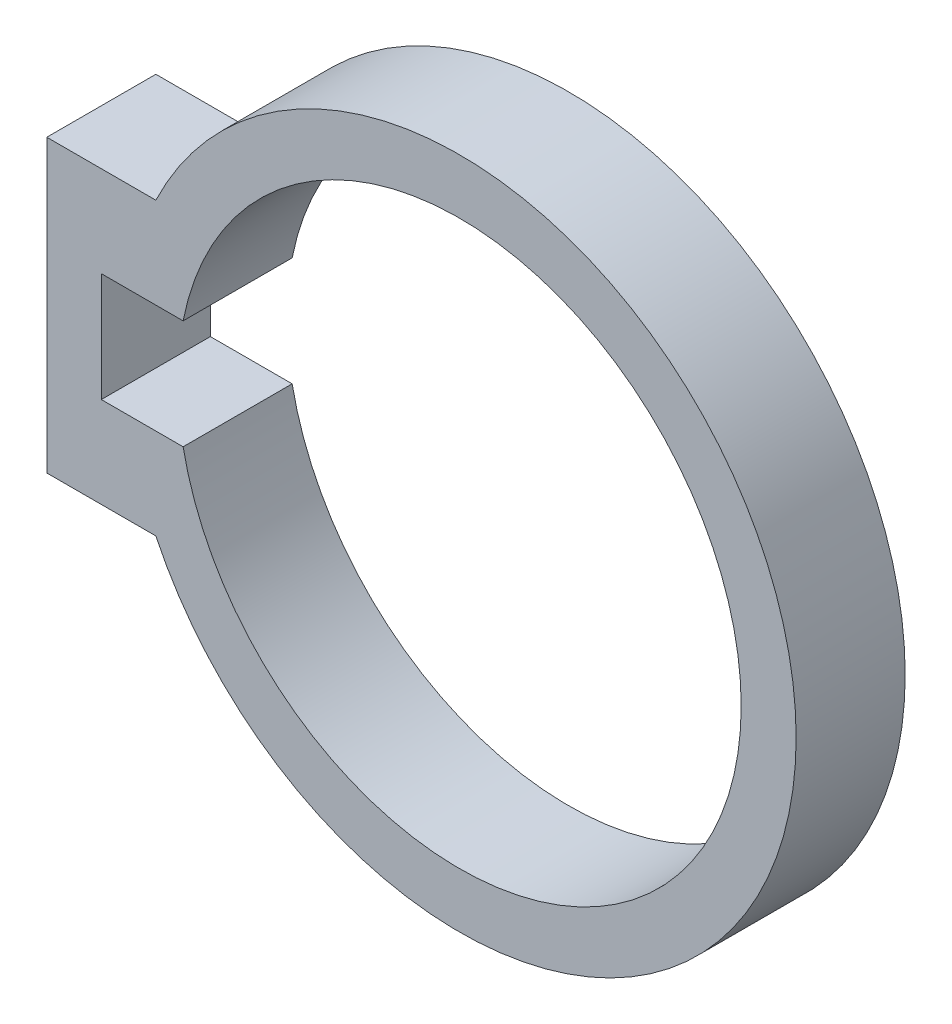
ISO-10303-21;
HEADER;
FILE_DESCRIPTION(('STEP AP214'),'2;1');
FILE_NAME('part.step','',(''),(''),'','','');
FILE_SCHEMA(('AUTOMOTIVE_DESIGN { 1 0 10303 214 1 1 1 1 }'));
ENDSEC;
DATA;
#1=APPLICATION_CONTEXT('core data for automotive mechanical design processes');
#2=APPLICATION_PROTOCOL_DEFINITION('international standard','automotive_design',2000,#1);
#3=PRODUCT_CONTEXT('',#1,'mechanical');
#4=PRODUCT('Part','Part','',(#3));
#5=PRODUCT_RELATED_PRODUCT_CATEGORY('part','',(#4));
#6=PRODUCT_DEFINITION_FORMATION('','',#4);
#7=PRODUCT_DEFINITION_CONTEXT('part definition',#1,'design');
#8=PRODUCT_DEFINITION('design','',#6,#7);
#9=PRODUCT_DEFINITION_SHAPE('','',#8);
#10=(LENGTH_UNIT() NAMED_UNIT(*) SI_UNIT(.MILLI.,.METRE.));
#11=(NAMED_UNIT(*) PLANE_ANGLE_UNIT() SI_UNIT($,.RADIAN.));
#12=(NAMED_UNIT(*) SI_UNIT($,.STERADIAN.) SOLID_ANGLE_UNIT());
#13=UNCERTAINTY_MEASURE_WITH_UNIT(LENGTH_MEASURE(1.E-05),#10,'distance_accuracy_value','');
#14=(GEOMETRIC_REPRESENTATION_CONTEXT(3) GLOBAL_UNCERTAINTY_ASSIGNED_CONTEXT((#13)) GLOBAL_UNIT_ASSIGNED_CONTEXT((#10,
#11,#12)) REPRESENTATION_CONTEXT('',''));
#15=CARTESIAN_POINT('',(0.,0.,0.));
#16=DIRECTION('',(0.,0.,1.));
#17=DIRECTION('',(1.,0.,0.));
#18=AXIS2_PLACEMENT_3D('',#15,#16,#17);
#19=CARTESIAN_POINT('',(22.7069063257455,-8.,6.));
#20=DIRECTION('',(0.,0.,-1.));
#21=DIRECTION('',(-1.,0.,0.));
#22=AXIS2_PLACEMENT_3D('',#19,#20,#21);
#23=PLANE('',#22);
#24=DIRECTION('',(0.,-1.,0.));
#25=VECTOR('',#24,1.);
#26=CARTESIAN_POINT('',(0.,0.,6.));
#27=LINE('',#26,#25);
#28=CARTESIAN_POINT('',(0.,0.,6.));
#29=VERTEX_POINT('',#28);
#30=CARTESIAN_POINT('',(0.,-16.,6.));
#31=VERTEX_POINT('',#30);
#32=EDGE_CURVE('E134',#29,#31,#27,.T.);
#33=ORIENTED_EDGE('',*,*,#32,.T.);
#34=DIRECTION('',(1.,0.,0.));
#35=VECTOR('',#34,1.);
#36=CARTESIAN_POINT('',(0.,-16.,6.));
#37=LINE('',#36,#35);
#38=CARTESIAN_POINT('',(6.00000000000001,-16.,6.));
#39=VERTEX_POINT('',#38);
#40=EDGE_CURVE('E137',#31,#39,#37,.T.);
#41=ORIENTED_EDGE('',*,*,#40,.T.);
#42=CARTESIAN_POINT('',(22.7069063257455,-8.,6.));
#43=DIRECTION('',(0.,0.,1.));
#44=DIRECTION('',(-1.,0.,0.));
#45=AXIS2_PLACEMENT_3D('',#42,#43,#44);
#46=CIRCLE('',#45,18.5235179967855);
#47=CARTESIAN_POINT('',(6.,0.,6.));
#48=VERTEX_POINT('',#47);
#49=EDGE_CURVE('E140',#39,#48,#46,.T.);
#50=ORIENTED_EDGE('',*,*,#49,.T.);
#51=DIRECTION('',(-1.,0.,0.));
#52=VECTOR('',#51,1.);
#53=CARTESIAN_POINT('',(0.,0.,6.));
#54=LINE('',#53,#52);
#55=EDGE_CURVE('E142',#48,#29,#54,.T.);
#56=ORIENTED_EDGE('',*,*,#55,.T.);
#57=EDGE_LOOP('',(#33,#41,#50,#56));
#58=FACE_BOUND('',#57,.T.);
#59=CARTESIAN_POINT('',(22.7069063257455,-7.99999999999999,6.));
#60=DIRECTION('',(0.,0.,1.));
#61=DIRECTION('',(-1.,0.,0.));
#62=AXIS2_PLACEMENT_3D('',#59,#60,#61);
#63=CIRCLE('',#62,15.5);
#64=CARTESIAN_POINT('',(7.5,-11.,6.));
#65=VERTEX_POINT('',#64);
#66=CARTESIAN_POINT('',(7.5,-5.,6.));
#67=VERTEX_POINT('',#66);
#68=EDGE_CURVE('E98',#65,#67,#63,.T.);
#69=ORIENTED_EDGE('',*,*,#68,.F.);
#70=DIRECTION('',(1.,0.,0.));
#71=VECTOR('',#70,1.);
#72=CARTESIAN_POINT('',(3.,-11.,6.));
#73=LINE('',#72,#71);
#74=CARTESIAN_POINT('',(3.,-11.,6.));
#75=VERTEX_POINT('',#74);
#76=EDGE_CURVE('E120',#75,#65,#73,.T.);
#77=ORIENTED_EDGE('',*,*,#76,.F.);
#78=DIRECTION('',(0.,-1.,0.));
#79=VECTOR('',#78,1.);
#80=CARTESIAN_POINT('',(3.,-5.,6.));
#81=LINE('',#80,#79);
#82=CARTESIAN_POINT('',(3.,-5.,6.));
#83=VERTEX_POINT('',#82);
#84=EDGE_CURVE('E118',#83,#75,#81,.T.);
#85=ORIENTED_EDGE('',*,*,#84,.F.);
#86=DIRECTION('',(-1.,0.,0.));
#87=VECTOR('',#86,1.);
#88=CARTESIAN_POINT('',(3.,-5.,6.));
#89=LINE('',#88,#87);
#90=EDGE_CURVE('E106',#67,#83,#89,.T.);
#91=ORIENTED_EDGE('',*,*,#90,.F.);
#92=EDGE_LOOP('',(#69,#77,#85,#91));
#93=FACE_BOUND('',#92,.T.);
#94=ADVANCED_FACE('F33',(#58,#93),#23,.F.);
#95=CARTESIAN_POINT('',(22.7069063257455,-8.,0.));
#96=DIRECTION('',(0.,0.,-1.));
#97=DIRECTION('',(-1.,0.,0.));
#98=AXIS2_PLACEMENT_3D('',#95,#96,#97);
#99=PLANE('',#98);
#100=DIRECTION('',(0.,-1.,0.));
#101=VECTOR('',#100,1.);
#102=CARTESIAN_POINT('',(0.,0.,0.));
#103=LINE('',#102,#101);
#104=CARTESIAN_POINT('',(0.,0.,0.));
#105=VERTEX_POINT('',#104);
#106=CARTESIAN_POINT('',(0.,-16.,0.));
#107=VERTEX_POINT('',#106);
#108=EDGE_CURVE('E114',#105,#107,#103,.T.);
#109=ORIENTED_EDGE('',*,*,#108,.F.);
#110=DIRECTION('',(-1.,0.,0.));
#111=VECTOR('',#110,1.);
#112=CARTESIAN_POINT('',(0.,0.,0.));
#113=LINE('',#112,#111);
#114=CARTESIAN_POINT('',(6.,0.,0.));
#115=VERTEX_POINT('',#114);
#116=EDGE_CURVE('E138',#115,#105,#113,.T.);
#117=ORIENTED_EDGE('',*,*,#116,.F.);
#118=CARTESIAN_POINT('',(22.7069063257455,-8.,0.));
#119=DIRECTION('',(0.,0.,1.));
#120=DIRECTION('',(-1.,0.,0.));
#121=AXIS2_PLACEMENT_3D('',#118,#119,#120);
#122=CIRCLE('',#121,18.5235179967855);
#123=CARTESIAN_POINT('',(6.00000000000001,-16.,0.));
#124=VERTEX_POINT('',#123);
#125=EDGE_CURVE('E149',#124,#115,#122,.T.);
#126=ORIENTED_EDGE('',*,*,#125,.F.);
#127=DIRECTION('',(1.,0.,0.));
#128=VECTOR('',#127,1.);
#129=CARTESIAN_POINT('',(0.,-16.,0.));
#130=LINE('',#129,#128);
#131=EDGE_CURVE('E147',#107,#124,#130,.T.);
#132=ORIENTED_EDGE('',*,*,#131,.F.);
#133=EDGE_LOOP('',(#109,#117,#126,#132));
#134=FACE_BOUND('',#133,.T.);
#135=DIRECTION('',(1.,0.,0.));
#136=VECTOR('',#135,1.);
#137=CARTESIAN_POINT('',(3.,-11.,0.));
#138=LINE('',#137,#136);
#139=CARTESIAN_POINT('',(3.,-11.,0.));
#140=VERTEX_POINT('',#139);
#141=CARTESIAN_POINT('',(7.5,-11.,0.));
#142=VERTEX_POINT('',#141);
#143=EDGE_CURVE('E107',#140,#142,#138,.T.);
#144=ORIENTED_EDGE('',*,*,#143,.T.);
#145=CARTESIAN_POINT('',(22.7069063257455,-7.99999999999999,0.));
#146=DIRECTION('',(0.,0.,1.));
#147=DIRECTION('',(-1.,0.,0.));
#148=AXIS2_PLACEMENT_3D('',#145,#146,#147);
#149=CIRCLE('',#148,15.5);
#150=CARTESIAN_POINT('',(7.5,-5.,0.));
#151=VERTEX_POINT('',#150);
#152=EDGE_CURVE('E56',#142,#151,#149,.T.);
#153=ORIENTED_EDGE('',*,*,#152,.T.);
#154=DIRECTION('',(-1.,0.,0.));
#155=VECTOR('',#154,1.);
#156=CARTESIAN_POINT('',(3.,-5.,0.));
#157=LINE('',#156,#155);
#158=CARTESIAN_POINT('',(3.,-5.,0.));
#159=VERTEX_POINT('',#158);
#160=EDGE_CURVE('E113',#151,#159,#157,.T.);
#161=ORIENTED_EDGE('',*,*,#160,.T.);
#162=DIRECTION('',(0.,-1.,0.));
#163=VECTOR('',#162,1.);
#164=CARTESIAN_POINT('',(3.,-5.,0.));
#165=LINE('',#164,#163);
#166=EDGE_CURVE('E126',#159,#140,#165,.T.);
#167=ORIENTED_EDGE('',*,*,#166,.T.);
#168=EDGE_LOOP('',(#144,#153,#161,#167));
#169=FACE_BOUND('',#168,.T.);
#170=ADVANCED_FACE('F167',(#134,#169),#99,.T.);
#171=CARTESIAN_POINT('',(0.,0.,6.));
#172=DIRECTION('',(1.,0.,0.));
#173=DIRECTION('',(0.,1.,0.));
#174=AXIS2_PLACEMENT_3D('',#171,#172,#173);
#175=PLANE('',#174);
#176=ORIENTED_EDGE('',*,*,#108,.T.);
#177=DIRECTION('',(0.,0.,-1.));
#178=VECTOR('',#177,1.);
#179=CARTESIAN_POINT('',(0.,-16.,6.));
#180=LINE('',#179,#178);
#181=EDGE_CURVE('E11',#31,#107,#180,.T.);
#182=ORIENTED_EDGE('',*,*,#181,.F.);
#183=ORIENTED_EDGE('',*,*,#32,.F.);
#184=DIRECTION('',(0.,0.,-1.));
#185=VECTOR('',#184,1.);
#186=CARTESIAN_POINT('',(0.,0.,6.));
#187=LINE('',#186,#185);
#188=EDGE_CURVE('E144',#29,#105,#187,.T.);
#189=ORIENTED_EDGE('',*,*,#188,.T.);
#190=EDGE_LOOP('',(#176,#182,#183,#189));
#191=FACE_BOUND('',#190,.T.);
#192=ADVANCED_FACE('F35',(#191),#175,.F.);
#193=CARTESIAN_POINT('',(0.,-16.,6.));
#194=DIRECTION('',(0.,1.,0.));
#195=DIRECTION('',(0.,0.,1.));
#196=AXIS2_PLACEMENT_3D('',#193,#194,#195);
#197=PLANE('',#196);
#198=ORIENTED_EDGE('',*,*,#131,.T.);
#199=DIRECTION('',(0.,0.,-1.));
#200=VECTOR('',#199,1.);
#201=CARTESIAN_POINT('',(6.00000000000001,-16.,6.));
#202=LINE('',#201,#200);
#203=EDGE_CURVE('E41',#39,#124,#202,.T.);
#204=ORIENTED_EDGE('',*,*,#203,.F.);
#205=ORIENTED_EDGE('',*,*,#40,.F.);
#206=ORIENTED_EDGE('',*,*,#181,.T.);
#207=EDGE_LOOP('',(#198,#204,#205,#206));
#208=FACE_BOUND('',#207,.T.);
#209=ADVANCED_FACE('F177',(#208),#197,.F.);
#210=CARTESIAN_POINT('',(22.7069063257455,-8.,6.));
#211=DIRECTION('',(0.,0.,-1.));
#212=DIRECTION('',(-1.,0.,0.));
#213=AXIS2_PLACEMENT_3D('',#210,#211,#212);
#214=CYLINDRICAL_SURFACE('',#213,18.5235179967855);
#215=ORIENTED_EDGE('',*,*,#125,.T.);
#216=DIRECTION('',(0.,0.,-1.));
#217=VECTOR('',#216,1.);
#218=CARTESIAN_POINT('',(6.,0.,6.));
#219=LINE('',#218,#217);
#220=EDGE_CURVE('E154',#48,#115,#219,.T.);
#221=ORIENTED_EDGE('',*,*,#220,.F.);
#222=ORIENTED_EDGE('',*,*,#49,.F.);
#223=ORIENTED_EDGE('',*,*,#203,.T.);
#224=EDGE_LOOP('',(#215,#221,#222,#223));
#225=FACE_BOUND('',#224,.T.);
#226=ADVANCED_FACE('F161',(#225),#214,.T.);
#227=CARTESIAN_POINT('',(0.,0.,6.));
#228=DIRECTION('',(0.,-1.,0.));
#229=DIRECTION('',(0.,0.,-1.));
#230=AXIS2_PLACEMENT_3D('',#227,#228,#229);
#231=PLANE('',#230);
#232=ORIENTED_EDGE('',*,*,#116,.T.);
#233=ORIENTED_EDGE('',*,*,#188,.F.);
#234=ORIENTED_EDGE('',*,*,#55,.F.);
#235=ORIENTED_EDGE('',*,*,#220,.T.);
#236=EDGE_LOOP('',(#232,#233,#234,#235));
#237=FACE_BOUND('',#236,.T.);
#238=ADVANCED_FACE('F171',(#237),#231,.F.);
#239=CARTESIAN_POINT('',(22.7069063257455,-7.99999999999999,6.));
#240=DIRECTION('',(0.,0.,-1.));
#241=DIRECTION('',(-1.,0.,0.));
#242=AXIS2_PLACEMENT_3D('',#239,#240,#241);
#243=CYLINDRICAL_SURFACE('',#242,15.5);
#244=ORIENTED_EDGE('',*,*,#152,.F.);
#245=DIRECTION('',(0.,0.,-1.));
#246=VECTOR('',#245,1.);
#247=CARTESIAN_POINT('',(7.5,-11.,6.));
#248=LINE('',#247,#246);
#249=EDGE_CURVE('E102',#65,#142,#248,.T.);
#250=ORIENTED_EDGE('',*,*,#249,.F.);
#251=ORIENTED_EDGE('',*,*,#68,.T.);
#252=DIRECTION('',(0.,0.,-1.));
#253=VECTOR('',#252,1.);
#254=CARTESIAN_POINT('',(7.5,-5.,6.));
#255=LINE('',#254,#253);
#256=EDGE_CURVE('E101',#67,#151,#255,.T.);
#257=ORIENTED_EDGE('',*,*,#256,.T.);
#258=EDGE_LOOP('',(#244,#250,#251,#257));
#259=FACE_BOUND('',#258,.T.);
#260=ADVANCED_FACE('F100',(#259),#243,.F.);
#261=CARTESIAN_POINT('',(3.,-5.,6.));
#262=DIRECTION('',(0.,-1.,0.));
#263=DIRECTION('',(0.,0.,-1.));
#264=AXIS2_PLACEMENT_3D('',#261,#262,#263);
#265=PLANE('',#264);
#266=ORIENTED_EDGE('',*,*,#160,.F.);
#267=ORIENTED_EDGE('',*,*,#256,.F.);
#268=ORIENTED_EDGE('',*,*,#90,.T.);
#269=DIRECTION('',(0.,0.,-1.));
#270=VECTOR('',#269,1.);
#271=CARTESIAN_POINT('',(3.,-5.,6.));
#272=LINE('',#271,#270);
#273=EDGE_CURVE('E115',#83,#159,#272,.T.);
#274=ORIENTED_EDGE('',*,*,#273,.T.);
#275=EDGE_LOOP('',(#266,#267,#268,#274));
#276=FACE_BOUND('',#275,.T.);
#277=ADVANCED_FACE('F110',(#276),#265,.T.);
#278=CARTESIAN_POINT('',(3.,-5.,6.));
#279=DIRECTION('',(1.,0.,0.));
#280=DIRECTION('',(0.,0.,-1.));
#281=AXIS2_PLACEMENT_3D('',#278,#279,#280);
#282=PLANE('',#281);
#283=ORIENTED_EDGE('',*,*,#166,.F.);
#284=ORIENTED_EDGE('',*,*,#273,.F.);
#285=ORIENTED_EDGE('',*,*,#84,.T.);
#286=DIRECTION('',(0.,0.,-1.));
#287=VECTOR('',#286,1.);
#288=CARTESIAN_POINT('',(3.,-11.,6.));
#289=LINE('',#288,#287);
#290=EDGE_CURVE('E48',#75,#140,#289,.T.);
#291=ORIENTED_EDGE('',*,*,#290,.T.);
#292=EDGE_LOOP('',(#283,#284,#285,#291));
#293=FACE_BOUND('',#292,.T.);
#294=ADVANCED_FACE('F200',(#293),#282,.T.);
#295=CARTESIAN_POINT('',(3.,-11.,6.));
#296=DIRECTION('',(0.,1.,0.));
#297=DIRECTION('',(0.,0.,1.));
#298=AXIS2_PLACEMENT_3D('',#295,#296,#297);
#299=PLANE('',#298);
#300=ORIENTED_EDGE('',*,*,#143,.F.);
#301=ORIENTED_EDGE('',*,*,#290,.F.);
#302=ORIENTED_EDGE('',*,*,#76,.T.);
#303=ORIENTED_EDGE('',*,*,#249,.T.);
#304=EDGE_LOOP('',(#300,#301,#302,#303));
#305=FACE_BOUND('',#304,.T.);
#306=ADVANCED_FACE('F204',(#305),#299,.T.);
#307=CLOSED_SHELL('',(#94,#170,#192,#209,#226,#238,#260,#277,#294,#306));
#308=MANIFOLD_SOLID_BREP('B2',#307);
#309=ADVANCED_BREP_SHAPE_REPRESENTATION('',(#18,#308),#14);
#310=SHAPE_DEFINITION_REPRESENTATION(#9,#309);
ENDSEC;
END-ISO-10303-21;
